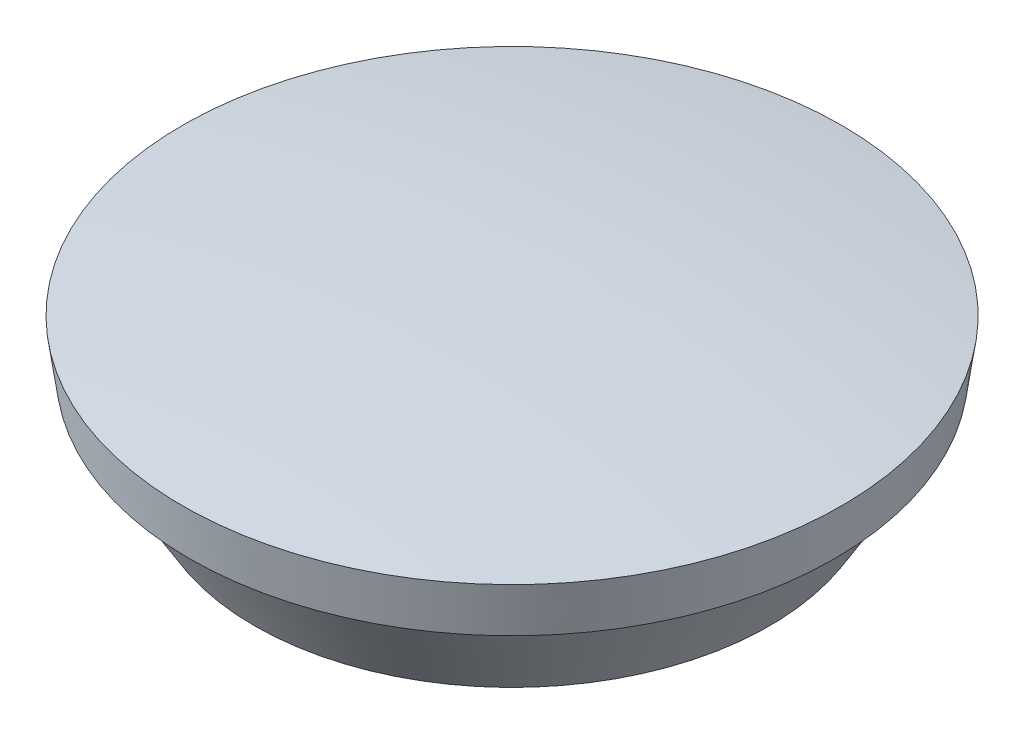
ISO-10303-21;
HEADER;
FILE_DESCRIPTION(('STEP AP214'),'2;1');
FILE_NAME('part.step','',(''),(''),'','','');
FILE_SCHEMA(('AUTOMOTIVE_DESIGN { 1 0 10303 214 1 1 1 1 }'));
ENDSEC;
DATA;
#1=APPLICATION_CONTEXT('core data for automotive mechanical design processes');
#2=APPLICATION_PROTOCOL_DEFINITION('international standard','automotive_design',2000,#1);
#3=PRODUCT_CONTEXT('',#1,'mechanical');
#4=PRODUCT('Part','Part','',(#3));
#5=PRODUCT_RELATED_PRODUCT_CATEGORY('part','',(#4));
#6=PRODUCT_DEFINITION_FORMATION('','',#4);
#7=PRODUCT_DEFINITION_CONTEXT('part definition',#1,'design');
#8=PRODUCT_DEFINITION('design','',#6,#7);
#9=PRODUCT_DEFINITION_SHAPE('','',#8);
#10=(LENGTH_UNIT() NAMED_UNIT(*) SI_UNIT(.MILLI.,.METRE.));
#11=(NAMED_UNIT(*) PLANE_ANGLE_UNIT() SI_UNIT($,.RADIAN.));
#12=(NAMED_UNIT(*) SI_UNIT($,.STERADIAN.) SOLID_ANGLE_UNIT());
#13=UNCERTAINTY_MEASURE_WITH_UNIT(LENGTH_MEASURE(1.E-05),#10,'distance_accuracy_value','');
#14=(GEOMETRIC_REPRESENTATION_CONTEXT(3) GLOBAL_UNCERTAINTY_ASSIGNED_CONTEXT((#13)) GLOBAL_UNIT_ASSIGNED_CONTEXT((#10,
#11,#12)) REPRESENTATION_CONTEXT('',''));
#15=CARTESIAN_POINT('',(0.,0.,0.));
#16=DIRECTION('',(0.,0.,1.));
#17=DIRECTION('',(1.,0.,0.));
#18=AXIS2_PLACEMENT_3D('',#15,#16,#17);
#19=CARTESIAN_POINT('',(0.,321.561079724369,1.01393428618166E-12));
#20=DIRECTION('',(0.,1.,0.));
#21=DIRECTION('',(0.,0.,1.));
#22=AXIS2_PLACEMENT_3D('',#19,#20,#21);
#23=CONICAL_SURFACE('',#22,46.181267187361,0.142640506657348);
#24=CARTESIAN_POINT('',(0.,328.628234589977,1.03657014094382E-12));
#25=DIRECTION('',(0.,-1.,0.));
#26=DIRECTION('',(0.,0.,-1.));
#27=AXIS2_PLACEMENT_3D('',#24,#25,#26);
#28=CIRCLE('',#27,47.1962226271886);
#29=CARTESIAN_POINT('',(0.,328.628234589977,-47.1962226271876));
#30=VERTEX_POINT('',#29);
#31=EDGE_CURVE('E11',#30,#30,#28,.T.);
#32=ORIENTED_EDGE('',*,*,#31,.T.);
#33=EDGE_LOOP('',(#32));
#34=FACE_BOUND('',#33,.T.);
#35=CARTESIAN_POINT('',(0.,321.561079724369,1.01393428618166E-12));
#36=DIRECTION('',(0.,-1.,0.));
#37=DIRECTION('',(0.,0.,-1.));
#38=AXIS2_PLACEMENT_3D('',#35,#36,#37);
#39=CIRCLE('',#38,46.181267187361);
#40=CARTESIAN_POINT('',(0.,321.561079724369,-46.1812671873599));
#41=VERTEX_POINT('',#40);
#42=EDGE_CURVE('E66',#41,#41,#39,.T.);
#43=ORIENTED_EDGE('',*,*,#42,.F.);
#44=EDGE_LOOP('',(#43));
#45=FACE_BOUND('',#44,.T.);
#46=ADVANCED_FACE('F34',(#34,#45),#23,.T.);
#47=CARTESIAN_POINT('',(0.,-1.0680345496894E-10,9.40567068674625E-12));
#48=DIRECTION('',(0.,-1.,0.));
#49=DIRECTION('',(0.,0.,-1.));
#50=AXIS2_PLACEMENT_3D('',#47,#48,#49);
#51=SPHERICAL_SURFACE('',#50,332.000000000107);
#52=ORIENTED_EDGE('',*,*,#31,.F.);
#53=EDGE_LOOP('',(#52));
#54=FACE_BOUND('',#53,.T.);
#55=ADVANCED_FACE('F46',(#54),#51,.T.);
#56=CARTESIAN_POINT('',(0.,274.04557242889,-0.772549145363541));
#57=DIRECTION('',(-1.,0.,0.));
#58=DIRECTION('',(0.,0.,-1.));
#59=AXIS2_PLACEMENT_3D('',#56,#57,#58);
#60=CIRCLE('',#59,49.9604009805697);
#61=TRIMMED_CURVE('',#60,(PARAMETER_VALUE(-1.58626017258224)),
(PARAMETER_VALUE(1.58626017258224)),.T.,.PARAMETER.);
#62=CARTESIAN_POINT('',(0.,274.04557242889,8.61723886691479E-13));
#63=DIRECTION('',(0.,-1.,0.));
#64=AXIS1_PLACEMENT('',#62,#63);
#65=SURFACE_OF_REVOLUTION('',#61,#64);
#66=CARTESIAN_POINT('',(0.,308.576990629941,9.72346693925712E-13));
#67=DIRECTION('',(0.,-1.,0.));
#68=DIRECTION('',(0.,0.,-1.));
#69=AXIS2_PLACEMENT_3D('',#66,#67,#68);
#70=CIRCLE('',#69,36.8782664649723);
#71=CARTESIAN_POINT('',(0.,308.576990629941,-36.8782664649713));
#72=VERTEX_POINT('',#71);
#73=EDGE_CURVE('E40',#72,#72,#70,.T.);
#74=ORIENTED_EDGE('',*,*,#73,.T.);
#75=EDGE_LOOP('',(#74));
#76=FACE_BOUND('',#75,.T.);
#77=CARTESIAN_POINT('',(0.,324.,1.29280267047172E-12));
#78=VERTEX_POINT('',#77);
#79=VERTEX_LOOP('',#78);
#80=FACE_BOUND('',#79,.T.);
#81=ADVANCED_FACE('F43',(#76,#80),#65,.F.);
#82=CARTESIAN_POINT('',(0.,308.576990629941,9.72346693925712E-13));
#83=DIRECTION('',(0.,1.,0.));
#84=DIRECTION('',(0.,0.,1.));
#85=AXIS2_PLACEMENT_3D('',#82,#83,#84);
#86=CONICAL_SURFACE('',#85,36.8782664649723,0.546433290900082);
#87=CARTESIAN_POINT('',(0.,321.561079724369,1.01393428618166E-12));
#88=DIRECTION('',(0.,-1.,0.));
#89=DIRECTION('',(0.,0.,-1.));
#90=AXIS2_PLACEMENT_3D('',#87,#88,#89);
#91=CIRCLE('',#90,44.775299461623);
#92=CARTESIAN_POINT('',(0.,321.561079724369,-44.775299461622));
#93=VERTEX_POINT('',#92);
#94=EDGE_CURVE('E68',#93,#93,#91,.T.);
#95=ORIENTED_EDGE('',*,*,#94,.T.);
#96=EDGE_LOOP('',(#95));
#97=FACE_BOUND('',#96,.T.);
#98=ORIENTED_EDGE('',*,*,#73,.F.);
#99=EDGE_LOOP('',(#98));
#100=FACE_BOUND('',#99,.T.);
#101=ADVANCED_FACE('F45',(#97,#100),#86,.T.);
#102=CARTESIAN_POINT('',(0.,321.561079724369,-46.1812671873599));
#103=DIRECTION('',(0.,-1.,0.));
#104=DIRECTION('',(0.,0.,-1.));
#105=AXIS2_PLACEMENT_3D('',#102,#103,#104);
#106=PLANE('',#105);
#107=ORIENTED_EDGE('',*,*,#42,.T.);
#108=EDGE_LOOP('',(#107));
#109=FACE_BOUND('',#108,.T.);
#110=ORIENTED_EDGE('',*,*,#94,.F.);
#111=EDGE_LOOP('',(#110));
#112=FACE_BOUND('',#111,.T.);
#113=ADVANCED_FACE('F53',(#109,#112),#106,.T.);
#114=CLOSED_SHELL('',(#46,#55,#81,#101,#113));
#115=MANIFOLD_SOLID_BREP('B2',#114);
#116=ADVANCED_BREP_SHAPE_REPRESENTATION('',(#18,#115),#14);
#117=SHAPE_DEFINITION_REPRESENTATION(#9,#116);
ENDSEC;
END-ISO-10303-21;
